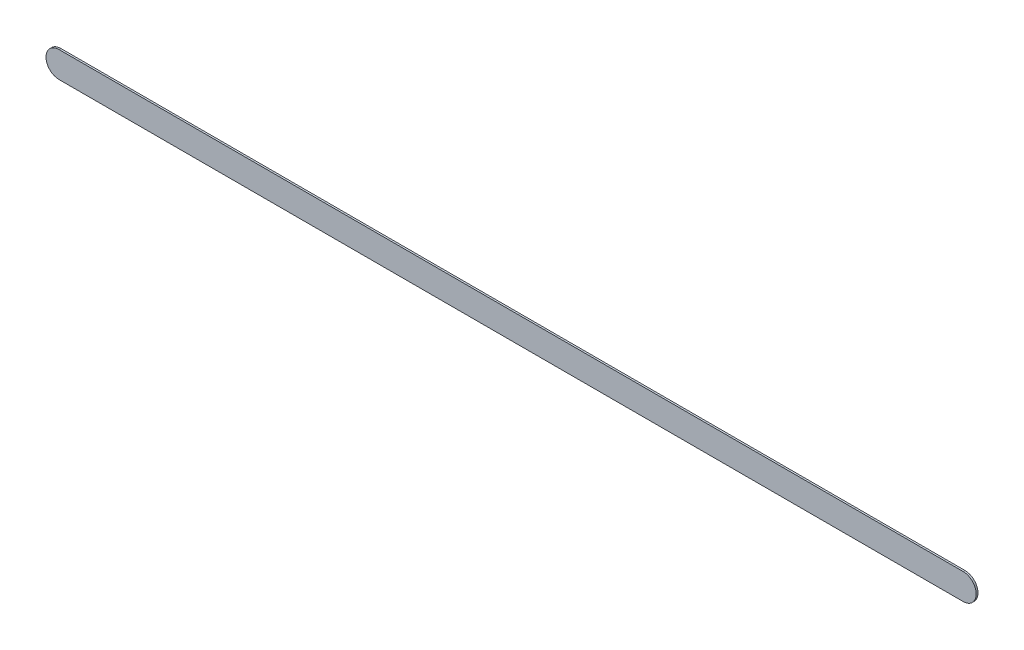
ISO-10303-21;
HEADER;
FILE_DESCRIPTION(('STEP AP214'),'2;1');
FILE_NAME('part.step','',(''),(''),'','','');
FILE_SCHEMA(('AUTOMOTIVE_DESIGN { 1 0 10303 214 1 1 1 1 }'));
ENDSEC;
DATA;
#1=APPLICATION_CONTEXT('core data for automotive mechanical design processes');
#2=APPLICATION_PROTOCOL_DEFINITION('international standard','automotive_design',2000,#1);
#3=PRODUCT_CONTEXT('',#1,'mechanical');
#4=PRODUCT('Part','Part','',(#3));
#5=PRODUCT_RELATED_PRODUCT_CATEGORY('part','',(#4));
#6=PRODUCT_DEFINITION_FORMATION('','',#4);
#7=PRODUCT_DEFINITION_CONTEXT('part definition',#1,'design');
#8=PRODUCT_DEFINITION('design','',#6,#7);
#9=PRODUCT_DEFINITION_SHAPE('','',#8);
#10=(LENGTH_UNIT() NAMED_UNIT(*) SI_UNIT(.MILLI.,.METRE.));
#11=(NAMED_UNIT(*) PLANE_ANGLE_UNIT() SI_UNIT($,.RADIAN.));
#12=(NAMED_UNIT(*) SI_UNIT($,.STERADIAN.) SOLID_ANGLE_UNIT());
#13=UNCERTAINTY_MEASURE_WITH_UNIT(LENGTH_MEASURE(1.E-05),#10,'distance_accuracy_value','');
#14=(GEOMETRIC_REPRESENTATION_CONTEXT(3) GLOBAL_UNCERTAINTY_ASSIGNED_CONTEXT((#13)) GLOBAL_UNIT_ASSIGNED_CONTEXT((#10,
#11,#12)) REPRESENTATION_CONTEXT('',''));
#15=CARTESIAN_POINT('',(0.,0.,0.));
#16=DIRECTION('',(0.,0.,1.));
#17=DIRECTION('',(1.,0.,0.));
#18=AXIS2_PLACEMENT_3D('',#15,#16,#17);
#19=CARTESIAN_POINT('',(41.01999924,89.75000084,0.));
#20=DIRECTION('',(0.,1.,0.));
#21=DIRECTION('',(1.,0.,0.));
#22=AXIS2_PLACEMENT_3D('',#19,#20,#21);
#23=PLANE('',#22);
#24=DIRECTION('',(1.,0.,0.));
#25=VECTOR('',#24,1.);
#26=CARTESIAN_POINT('',(41.01999924,89.75000084,0.03556));
#27=LINE('',#26,#25);
#28=CARTESIAN_POINT('',(41.01999924,89.75000084,0.03556));
#29=VERTEX_POINT('',#28);
#30=CARTESIAN_POINT('',(58.40000004,89.75000084,0.03556));
#31=VERTEX_POINT('',#30);
#32=EDGE_CURVE('E11',#29,#31,#27,.T.);
#33=ORIENTED_EDGE('',*,*,#32,.F.);
#34=DIRECTION('',(0.,0.,1.));
#35=VECTOR('',#34,1.);
#36=CARTESIAN_POINT('',(41.01999924,89.75000084,0.));
#37=LINE('',#36,#35);
#38=CARTESIAN_POINT('',(41.01999924,89.75000084,0.));
#39=VERTEX_POINT('',#38);
#40=EDGE_CURVE('E24',#39,#29,#37,.T.);
#41=ORIENTED_EDGE('',*,*,#40,.F.);
#42=DIRECTION('',(1.,0.,0.));
#43=VECTOR('',#42,1.);
#44=CARTESIAN_POINT('',(41.01999924,89.75000084,0.));
#45=LINE('',#44,#43);
#46=CARTESIAN_POINT('',(58.40000004,89.75000084,0.));
#47=VERTEX_POINT('',#46);
#48=EDGE_CURVE('E75',#39,#47,#45,.T.);
#49=ORIENTED_EDGE('',*,*,#48,.T.);
#50=DIRECTION('',(0.,0.,1.));
#51=VECTOR('',#50,1.);
#52=CARTESIAN_POINT('',(58.40000004,89.75000084,0.));
#53=LINE('',#52,#51);
#54=EDGE_CURVE('E37',#47,#31,#53,.T.);
#55=ORIENTED_EDGE('',*,*,#54,.T.);
#56=EDGE_LOOP('',(#33,#41,#49,#55));
#57=FACE_BOUND('',#56,.T.);
#58=ADVANCED_FACE('F17',(#57),#23,.F.);
#59=CARTESIAN_POINT('',(58.40000004,90.00000034,0.));
#60=DIRECTION('',(0.,0.,-1.));
#61=DIRECTION('',(0.,-1.,0.));
#62=AXIS2_PLACEMENT_3D('',#59,#60,#61);
#63=CYLINDRICAL_SURFACE('',#62,0.249999499999994);
#64=CARTESIAN_POINT('',(58.40000004,90.00000034,0.03556));
#65=DIRECTION('',(0.,0.,1.));
#66=DIRECTION('',(0.,-1.,0.));
#67=AXIS2_PLACEMENT_3D('',#64,#65,#66);
#68=CIRCLE('',#67,0.249999499999994);
#69=CARTESIAN_POINT('',(58.40000004,90.24999984,0.03556));
#70=VERTEX_POINT('',#69);
#71=EDGE_CURVE('E83',#31,#70,#68,.T.);
#72=ORIENTED_EDGE('',*,*,#71,.F.);
#73=ORIENTED_EDGE('',*,*,#54,.F.);
#74=CARTESIAN_POINT('',(58.40000004,90.00000034,0.));
#75=DIRECTION('',(0.,0.,1.));
#76=DIRECTION('',(0.,-1.,0.));
#77=AXIS2_PLACEMENT_3D('',#74,#75,#76);
#78=CIRCLE('',#77,0.249999499999994);
#79=CARTESIAN_POINT('',(58.40000004,90.24999984,0.));
#80=VERTEX_POINT('',#79);
#81=EDGE_CURVE('E81',#47,#80,#78,.T.);
#82=ORIENTED_EDGE('',*,*,#81,.T.);
#83=DIRECTION('',(0.,0.,1.));
#84=VECTOR('',#83,1.);
#85=CARTESIAN_POINT('',(58.40000004,90.24999984,0.));
#86=LINE('',#85,#84);
#87=EDGE_CURVE('E67',#80,#70,#86,.T.);
#88=ORIENTED_EDGE('',*,*,#87,.T.);
#89=EDGE_LOOP('',(#72,#73,#82,#88));
#90=FACE_BOUND('',#89,.T.);
#91=ADVANCED_FACE('F89',(#90),#63,.T.);
#92=CARTESIAN_POINT('',(58.40000004,90.24999984,0.));
#93=DIRECTION('',(0.,-1.,0.));
#94=DIRECTION('',(-1.,0.,0.));
#95=AXIS2_PLACEMENT_3D('',#92,#93,#94);
#96=PLANE('',#95);
#97=DIRECTION('',(-1.,0.,0.));
#98=VECTOR('',#97,1.);
#99=CARTESIAN_POINT('',(58.40000004,90.24999984,0.03556));
#100=LINE('',#99,#98);
#101=CARTESIAN_POINT('',(41.01999924,90.24999984,0.03556));
#102=VERTEX_POINT('',#101);
#103=EDGE_CURVE('E71',#70,#102,#100,.T.);
#104=ORIENTED_EDGE('',*,*,#103,.F.);
#105=ORIENTED_EDGE('',*,*,#87,.F.);
#106=DIRECTION('',(-1.,0.,0.));
#107=VECTOR('',#106,1.);
#108=CARTESIAN_POINT('',(58.40000004,90.24999984,0.));
#109=LINE('',#108,#107);
#110=CARTESIAN_POINT('',(41.01999924,90.24999984,0.));
#111=VERTEX_POINT('',#110);
#112=EDGE_CURVE('E63',#80,#111,#109,.T.);
#113=ORIENTED_EDGE('',*,*,#112,.T.);
#114=DIRECTION('',(0.,0.,1.));
#115=VECTOR('',#114,1.);
#116=CARTESIAN_POINT('',(41.01999924,90.24999984,0.));
#117=LINE('',#116,#115);
#118=EDGE_CURVE('E53',#111,#102,#117,.T.);
#119=ORIENTED_EDGE('',*,*,#118,.T.);
#120=EDGE_LOOP('',(#104,#105,#113,#119));
#121=FACE_BOUND('',#120,.T.);
#122=ADVANCED_FACE('F66',(#121),#96,.F.);
#123=CARTESIAN_POINT('',(41.01999924,90.00000034,0.));
#124=DIRECTION('',(0.,0.,-1.));
#125=DIRECTION('',(0.,1.,0.));
#126=AXIS2_PLACEMENT_3D('',#123,#124,#125);
#127=CYLINDRICAL_SURFACE('',#126,0.249999499999994);
#128=CARTESIAN_POINT('',(41.01999924,90.00000034,0.03556));
#129=DIRECTION('',(0.,0.,1.));
#130=DIRECTION('',(0.,1.,0.));
#131=AXIS2_PLACEMENT_3D('',#128,#129,#130);
#132=CIRCLE('',#131,0.249999499999994);
#133=EDGE_CURVE('E59',#102,#29,#132,.T.);
#134=ORIENTED_EDGE('',*,*,#133,.F.);
#135=ORIENTED_EDGE('',*,*,#118,.F.);
#136=CARTESIAN_POINT('',(41.01999924,90.00000034,0.));
#137=DIRECTION('',(0.,0.,1.));
#138=DIRECTION('',(0.,1.,0.));
#139=AXIS2_PLACEMENT_3D('',#136,#137,#138);
#140=CIRCLE('',#139,0.249999499999994);
#141=EDGE_CURVE('E57',#111,#39,#140,.T.);
#142=ORIENTED_EDGE('',*,*,#141,.T.);
#143=ORIENTED_EDGE('',*,*,#40,.T.);
#144=EDGE_LOOP('',(#134,#135,#142,#143));
#145=FACE_BOUND('',#144,.T.);
#146=ADVANCED_FACE('F55',(#145),#127,.T.);
#147=CARTESIAN_POINT('',(41.01999924,89.75000084,0.));
#148=DIRECTION('',(0.,0.,-1.));
#149=DIRECTION('',(-1.,0.,0.));
#150=AXIS2_PLACEMENT_3D('',#147,#148,#149);
#151=PLANE('',#150);
#152=ORIENTED_EDGE('',*,*,#141,.F.);
#153=ORIENTED_EDGE('',*,*,#112,.F.);
#154=ORIENTED_EDGE('',*,*,#81,.F.);
#155=ORIENTED_EDGE('',*,*,#48,.F.);
#156=EDGE_LOOP('',(#152,#153,#154,#155));
#157=FACE_BOUND('',#156,.T.);
#158=ADVANCED_FACE('F74',(#157),#151,.T.);
#159=CARTESIAN_POINT('',(41.01999924,89.75000084,0.03556));
#160=DIRECTION('',(0.,0.,-1.));
#161=DIRECTION('',(-1.,0.,0.));
#162=AXIS2_PLACEMENT_3D('',#159,#160,#161);
#163=PLANE('',#162);
#164=ORIENTED_EDGE('',*,*,#32,.T.);
#165=ORIENTED_EDGE('',*,*,#71,.T.);
#166=ORIENTED_EDGE('',*,*,#103,.T.);
#167=ORIENTED_EDGE('',*,*,#133,.T.);
#168=EDGE_LOOP('',(#164,#165,#166,#167));
#169=FACE_BOUND('',#168,.T.);
#170=ADVANCED_FACE('F91',(#169),#163,.F.);
#171=CLOSED_SHELL('',(#58,#91,#122,#146,#158,#170));
#172=MANIFOLD_SOLID_BREP('B1',#171);
#173=ADVANCED_BREP_SHAPE_REPRESENTATION('',(#18,#172),#14);
#174=SHAPE_DEFINITION_REPRESENTATION(#9,#173);
ENDSEC;
END-ISO-10303-21;
